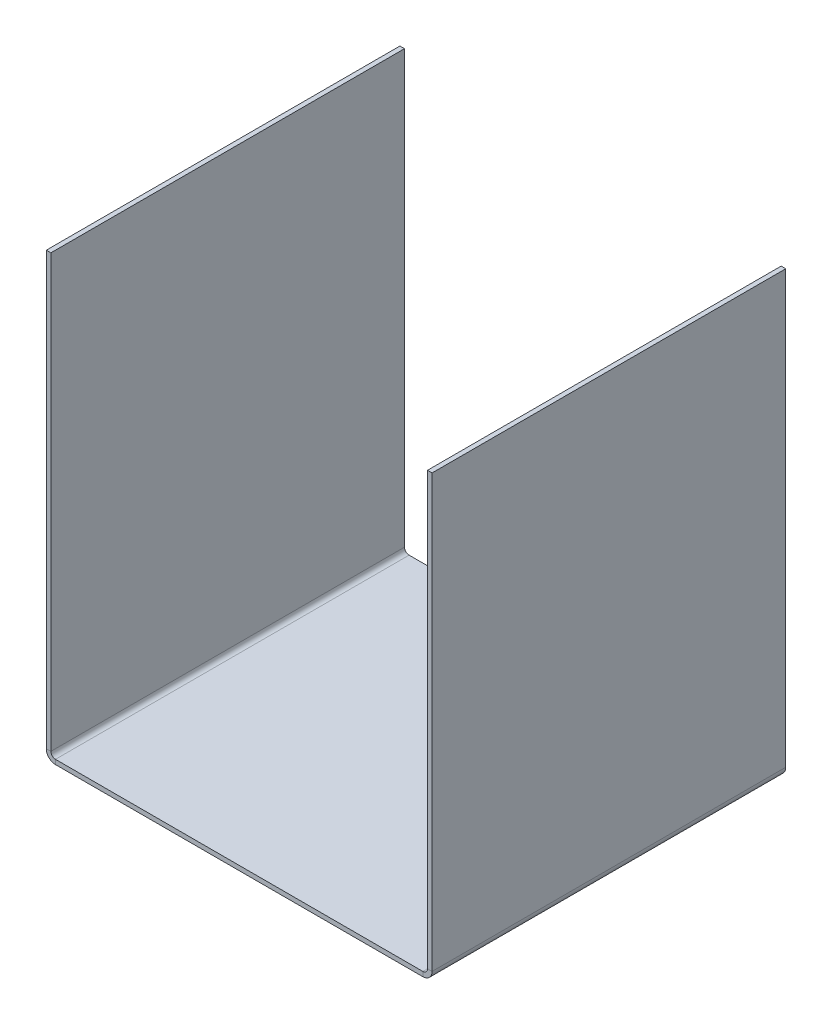
ISO-10303-21;
HEADER;
FILE_DESCRIPTION(('STEP AP214'),'2;1');
FILE_NAME('part.step','',(''),(''),'','','');
FILE_SCHEMA(('AUTOMOTIVE_DESIGN { 1 0 10303 214 1 1 1 1 }'));
ENDSEC;
DATA;
#1=APPLICATION_CONTEXT('core data for automotive mechanical design processes');
#2=APPLICATION_PROTOCOL_DEFINITION('international standard','automotive_design',2000,#1);
#3=PRODUCT_CONTEXT('',#1,'mechanical');
#4=PRODUCT('Part','Part','',(#3));
#5=PRODUCT_RELATED_PRODUCT_CATEGORY('part','',(#4));
#6=PRODUCT_DEFINITION_FORMATION('','',#4);
#7=PRODUCT_DEFINITION_CONTEXT('part definition',#1,'design');
#8=PRODUCT_DEFINITION('design','',#6,#7);
#9=PRODUCT_DEFINITION_SHAPE('','',#8);
#10=(LENGTH_UNIT() NAMED_UNIT(*) SI_UNIT(.MILLI.,.METRE.));
#11=(NAMED_UNIT(*) PLANE_ANGLE_UNIT() SI_UNIT($,.RADIAN.));
#12=(NAMED_UNIT(*) SI_UNIT($,.STERADIAN.) SOLID_ANGLE_UNIT());
#13=UNCERTAINTY_MEASURE_WITH_UNIT(LENGTH_MEASURE(1.E-05),#10,'distance_accuracy_value','');
#14=(GEOMETRIC_REPRESENTATION_CONTEXT(3) GLOBAL_UNCERTAINTY_ASSIGNED_CONTEXT((#13)) GLOBAL_UNIT_ASSIGNED_CONTEXT((#10,
#11,#12)) REPRESENTATION_CONTEXT('',''));
#15=CARTESIAN_POINT('',(0.,0.,0.));
#16=DIRECTION('',(0.,0.,1.));
#17=DIRECTION('',(1.,0.,0.));
#18=AXIS2_PLACEMENT_3D('',#15,#16,#17);
#19=CARTESIAN_POINT('',(-205.,-235.,5.));
#20=DIRECTION('',(0.,0.,1.));
#21=DIRECTION('',(-1.,0.,0.));
#22=AXIS2_PLACEMENT_3D('',#19,#20,#21);
#23=PLANE('',#22);
#24=DIRECTION('',(0.,1.,0.));
#25=VECTOR('',#24,1.);
#26=CARTESIAN_POINT('',(200.,-235.,5.));
#27=LINE('',#26,#25);
#28=CARTESIAN_POINT('',(200.,-240.,5.));
#29=VERTEX_POINT('',#28);
#30=CARTESIAN_POINT('',(200.,-235.,5.));
#31=VERTEX_POINT('',#30);
#32=EDGE_CURVE('E11',#29,#31,#27,.T.);
#33=ORIENTED_EDGE('',*,*,#32,.F.);
#34=DIRECTION('',(1.,0.,0.));
#35=VECTOR('',#34,1.);
#36=CARTESIAN_POINT('',(-205.,-240.,5.));
#37=LINE('',#36,#35);
#38=CARTESIAN_POINT('',(-200.,-240.,5.));
#39=VERTEX_POINT('',#38);
#40=EDGE_CURVE('E94',#29,#39,#37,.F.);
#41=ORIENTED_EDGE('',*,*,#40,.T.);
#42=DIRECTION('',(0.,1.,0.));
#43=VECTOR('',#42,1.);
#44=CARTESIAN_POINT('',(-200.,-235.,5.));
#45=LINE('',#44,#43);
#46=CARTESIAN_POINT('',(-200.,-235.,5.));
#47=VERTEX_POINT('',#46);
#48=EDGE_CURVE('E47',#39,#47,#45,.T.);
#49=ORIENTED_EDGE('',*,*,#48,.T.);
#50=DIRECTION('',(-1.,0.,0.));
#51=VECTOR('',#50,1.);
#52=CARTESIAN_POINT('',(-205.,-235.,5.));
#53=LINE('',#52,#51);
#54=EDGE_CURVE('E96',#31,#47,#53,.T.);
#55=ORIENTED_EDGE('',*,*,#54,.F.);
#56=EDGE_LOOP('',(#33,#41,#49,#55));
#57=FACE_BOUND('',#56,.T.);
#58=ADVANCED_FACE('F37',(#57),#23,.F.);
#59=CARTESIAN_POINT('',(-200.,-230.,5.));
#60=DIRECTION('',(0.,0.,-1.));
#61=DIRECTION('',(-1.,0.,0.));
#62=AXIS2_PLACEMENT_3D('',#59,#60,#61);
#63=PLANE('',#62);
#64=ORIENTED_EDGE('',*,*,#48,.F.);
#65=CARTESIAN_POINT('',(-200.,-230.,5.));
#66=DIRECTION('',(0.,0.,1.));
#67=DIRECTION('',(1.,0.,0.));
#68=AXIS2_PLACEMENT_3D('',#65,#66,#67);
#69=CIRCLE('',#68,10.);
#70=CARTESIAN_POINT('',(-210.,-230.,5.));
#71=VERTEX_POINT('',#70);
#72=EDGE_CURVE('E135',#39,#71,#69,.F.);
#73=ORIENTED_EDGE('',*,*,#72,.T.);
#74=DIRECTION('',(1.,0.,0.));
#75=VECTOR('',#74,1.);
#76=CARTESIAN_POINT('',(-205.,-230.,5.));
#77=LINE('',#76,#75);
#78=CARTESIAN_POINT('',(-205.,-230.,5.));
#79=VERTEX_POINT('',#78);
#80=EDGE_CURVE('E162',#71,#79,#77,.T.);
#81=ORIENTED_EDGE('',*,*,#80,.T.);
#82=CARTESIAN_POINT('',(-200.,-230.,5.));
#83=DIRECTION('',(0.,0.,1.));
#84=DIRECTION('',(1.,0.,0.));
#85=AXIS2_PLACEMENT_3D('',#82,#83,#84);
#86=CIRCLE('',#85,5.);
#87=EDGE_CURVE('E171',#47,#79,#86,.F.);
#88=ORIENTED_EDGE('',*,*,#87,.F.);
#89=EDGE_LOOP('',(#64,#73,#81,#88));
#90=FACE_BOUND('',#89,.T.);
#91=ADVANCED_FACE('F170',(#90),#63,.T.);
#92=CARTESIAN_POINT('',(-205.,240.,5.));
#93=DIRECTION('',(0.,0.,1.));
#94=DIRECTION('',(0.,1.,0.));
#95=AXIS2_PLACEMENT_3D('',#92,#93,#94);
#96=PLANE('',#95);
#97=ORIENTED_EDGE('',*,*,#80,.F.);
#98=DIRECTION('',(0.,-1.,0.));
#99=VECTOR('',#98,1.);
#100=CARTESIAN_POINT('',(-210.,240.,5.));
#101=LINE('',#100,#99);
#102=CARTESIAN_POINT('',(-210.,240.,5.));
#103=VERTEX_POINT('',#102);
#104=EDGE_CURVE('E132',#71,#103,#101,.F.);
#105=ORIENTED_EDGE('',*,*,#104,.T.);
#106=DIRECTION('',(1.,0.,0.));
#107=VECTOR('',#106,1.);
#108=CARTESIAN_POINT('',(-205.,240.,5.));
#109=LINE('',#108,#107);
#110=CARTESIAN_POINT('',(-205.,240.,5.));
#111=VERTEX_POINT('',#110);
#112=EDGE_CURVE('E159',#103,#111,#109,.T.);
#113=ORIENTED_EDGE('',*,*,#112,.T.);
#114=DIRECTION('',(0.,1.,0.));
#115=VECTOR('',#114,1.);
#116=CARTESIAN_POINT('',(-205.,240.,5.));
#117=LINE('',#116,#115);
#118=EDGE_CURVE('E190',#79,#111,#117,.T.);
#119=ORIENTED_EDGE('',*,*,#118,.F.);
#120=EDGE_LOOP('',(#97,#105,#113,#119));
#121=FACE_BOUND('',#120,.T.);
#122=ADVANCED_FACE('F191',(#121),#96,.F.);
#123=CARTESIAN_POINT('',(-205.,240.,390.));
#124=DIRECTION('',(0.,1.,0.));
#125=DIRECTION('',(0.,0.,-1.));
#126=AXIS2_PLACEMENT_3D('',#123,#124,#125);
#127=PLANE('',#126);
#128=ORIENTED_EDGE('',*,*,#112,.F.);
#129=DIRECTION('',(0.,0.,1.));
#130=VECTOR('',#129,1.);
#131=CARTESIAN_POINT('',(-210.,240.,390.));
#132=LINE('',#131,#130);
#133=CARTESIAN_POINT('',(-210.,240.,390.));
#134=VERTEX_POINT('',#133);
#135=EDGE_CURVE('E228',#134,#103,#132,.F.);
#136=ORIENTED_EDGE('',*,*,#135,.F.);
#137=DIRECTION('',(1.,0.,0.));
#138=VECTOR('',#137,1.);
#139=CARTESIAN_POINT('',(-205.,240.,390.));
#140=LINE('',#139,#138);
#141=CARTESIAN_POINT('',(-205.,240.,390.));
#142=VERTEX_POINT('',#141);
#143=EDGE_CURVE('E156',#134,#142,#140,.T.);
#144=ORIENTED_EDGE('',*,*,#143,.T.);
#145=DIRECTION('',(0.,0.,-1.));
#146=VECTOR('',#145,1.);
#147=CARTESIAN_POINT('',(-205.,240.,390.));
#148=LINE('',#147,#146);
#149=EDGE_CURVE('E195',#142,#111,#148,.T.);
#150=ORIENTED_EDGE('',*,*,#149,.T.);
#151=EDGE_LOOP('',(#128,#136,#144,#150));
#152=FACE_BOUND('',#151,.T.);
#153=ADVANCED_FACE('F239',(#152),#127,.T.);
#154=CARTESIAN_POINT('',(-205.,240.,390.));
#155=DIRECTION('',(0.,0.,1.));
#156=DIRECTION('',(0.,1.,0.));
#157=AXIS2_PLACEMENT_3D('',#154,#155,#156);
#158=PLANE('',#157);
#159=ORIENTED_EDGE('',*,*,#143,.F.);
#160=DIRECTION('',(0.,-1.,0.));
#161=VECTOR('',#160,1.);
#162=CARTESIAN_POINT('',(-210.,240.,390.));
#163=LINE('',#162,#161);
#164=CARTESIAN_POINT('',(-210.,-230.,390.));
#165=VERTEX_POINT('',#164);
#166=EDGE_CURVE('E125',#165,#134,#163,.F.);
#167=ORIENTED_EDGE('',*,*,#166,.F.);
#168=DIRECTION('',(1.,0.,0.));
#169=VECTOR('',#168,1.);
#170=CARTESIAN_POINT('',(-205.,-230.,390.));
#171=LINE('',#170,#169);
#172=CARTESIAN_POINT('',(-205.,-230.,390.));
#173=VERTEX_POINT('',#172);
#174=EDGE_CURVE('E153',#165,#173,#171,.T.);
#175=ORIENTED_EDGE('',*,*,#174,.T.);
#176=DIRECTION('',(0.,1.,0.));
#177=VECTOR('',#176,1.);
#178=CARTESIAN_POINT('',(-205.,240.,390.));
#179=LINE('',#178,#177);
#180=EDGE_CURVE('E201',#173,#142,#179,.T.);
#181=ORIENTED_EDGE('',*,*,#180,.T.);
#182=EDGE_LOOP('',(#159,#167,#175,#181));
#183=FACE_BOUND('',#182,.T.);
#184=ADVANCED_FACE('F289',(#183),#158,.T.);
#185=CARTESIAN_POINT('',(-200.,-230.,390.));
#186=DIRECTION('',(0.,0.,1.));
#187=DIRECTION('',(1.,0.,0.));
#188=AXIS2_PLACEMENT_3D('',#185,#186,#187);
#189=PLANE('',#188);
#190=ORIENTED_EDGE('',*,*,#174,.F.);
#191=CARTESIAN_POINT('',(-200.,-230.,390.));
#192=DIRECTION('',(0.,0.,1.));
#193=DIRECTION('',(1.,0.,0.));
#194=AXIS2_PLACEMENT_3D('',#191,#192,#193);
#195=CIRCLE('',#194,10.);
#196=CARTESIAN_POINT('',(-200.,-240.,390.));
#197=VERTEX_POINT('',#196);
#198=EDGE_CURVE('E130',#165,#197,#195,.T.);
#199=ORIENTED_EDGE('',*,*,#198,.T.);
#200=DIRECTION('',(0.,1.,0.));
#201=VECTOR('',#200,1.);
#202=CARTESIAN_POINT('',(-200.,-235.,390.));
#203=LINE('',#202,#201);
#204=CARTESIAN_POINT('',(-200.,-235.,390.));
#205=VERTEX_POINT('',#204);
#206=EDGE_CURVE('E151',#197,#205,#203,.T.);
#207=ORIENTED_EDGE('',*,*,#206,.T.);
#208=CARTESIAN_POINT('',(-200.,-230.,390.));
#209=DIRECTION('',(0.,0.,-1.));
#210=DIRECTION('',(-1.,0.,0.));
#211=AXIS2_PLACEMENT_3D('',#208,#209,#210);
#212=CIRCLE('',#211,5.);
#213=EDGE_CURVE('E187',#173,#205,#212,.F.);
#214=ORIENTED_EDGE('',*,*,#213,.F.);
#215=EDGE_LOOP('',(#190,#199,#207,#214));
#216=FACE_BOUND('',#215,.T.);
#217=ADVANCED_FACE('F291',(#216),#189,.T.);
#218=CARTESIAN_POINT('',(-205.,-235.,390.));
#219=DIRECTION('',(0.,0.,1.));
#220=DIRECTION('',(-1.,0.,0.));
#221=AXIS2_PLACEMENT_3D('',#218,#219,#220);
#222=PLANE('',#221);
#223=ORIENTED_EDGE('',*,*,#206,.F.);
#224=DIRECTION('',(1.,0.,0.));
#225=VECTOR('',#224,1.);
#226=CARTESIAN_POINT('',(-205.,-240.,390.));
#227=LINE('',#226,#225);
#228=CARTESIAN_POINT('',(200.,-240.,390.));
#229=VERTEX_POINT('',#228);
#230=EDGE_CURVE('E124',#229,#197,#227,.F.);
#231=ORIENTED_EDGE('',*,*,#230,.F.);
#232=DIRECTION('',(0.,1.,0.));
#233=VECTOR('',#232,1.);
#234=CARTESIAN_POINT('',(200.,-235.,390.));
#235=LINE('',#234,#233);
#236=CARTESIAN_POINT('',(200.,-235.,390.));
#237=VERTEX_POINT('',#236);
#238=EDGE_CURVE('E148',#229,#237,#235,.T.);
#239=ORIENTED_EDGE('',*,*,#238,.T.);
#240=DIRECTION('',(-1.,0.,0.));
#241=VECTOR('',#240,1.);
#242=CARTESIAN_POINT('',(-205.,-235.,390.));
#243=LINE('',#242,#241);
#244=EDGE_CURVE('E246',#237,#205,#243,.T.);
#245=ORIENTED_EDGE('',*,*,#244,.T.);
#246=EDGE_LOOP('',(#223,#231,#239,#245));
#247=FACE_BOUND('',#246,.T.);
#248=ADVANCED_FACE('F294',(#247),#222,.T.);
#249=CARTESIAN_POINT('',(200.,-230.,390.));
#250=DIRECTION('',(0.,0.,1.));
#251=DIRECTION('',(1.,0.,0.));
#252=AXIS2_PLACEMENT_3D('',#249,#250,#251);
#253=PLANE('',#252);
#254=ORIENTED_EDGE('',*,*,#238,.F.);
#255=CARTESIAN_POINT('',(200.,-230.,390.));
#256=DIRECTION('',(0.,0.,1.));
#257=DIRECTION('',(1.,0.,0.));
#258=AXIS2_PLACEMENT_3D('',#255,#256,#257);
#259=CIRCLE('',#258,10.);
#260=CARTESIAN_POINT('',(210.,-230.,390.));
#261=VERTEX_POINT('',#260);
#262=EDGE_CURVE('E112',#229,#261,#259,.T.);
#263=ORIENTED_EDGE('',*,*,#262,.T.);
#264=DIRECTION('',(-1.,0.,0.));
#265=VECTOR('',#264,1.);
#266=CARTESIAN_POINT('',(205.,-230.,390.));
#267=LINE('',#266,#265);
#268=CARTESIAN_POINT('',(205.,-230.,390.));
#269=VERTEX_POINT('',#268);
#270=EDGE_CURVE('E145',#261,#269,#267,.T.);
#271=ORIENTED_EDGE('',*,*,#270,.T.);
#272=CARTESIAN_POINT('',(200.,-230.,390.));
#273=DIRECTION('',(0.,0.,-1.));
#274=DIRECTION('',(-1.,0.,0.));
#275=AXIS2_PLACEMENT_3D('',#272,#273,#274);
#276=CIRCLE('',#275,5.);
#277=EDGE_CURVE('E196',#237,#269,#276,.F.);
#278=ORIENTED_EDGE('',*,*,#277,.F.);
#279=EDGE_LOOP('',(#254,#263,#271,#278));
#280=FACE_BOUND('',#279,.T.);
#281=ADVANCED_FACE('F321',(#280),#253,.T.);
#282=CARTESIAN_POINT('',(205.,-235.,390.));
#283=DIRECTION('',(0.,0.,1.));
#284=DIRECTION('',(0.,-1.,0.));
#285=AXIS2_PLACEMENT_3D('',#282,#283,#284);
#286=PLANE('',#285);
#287=ORIENTED_EDGE('',*,*,#270,.F.);
#288=DIRECTION('',(0.,1.,0.));
#289=VECTOR('',#288,1.);
#290=CARTESIAN_POINT('',(210.,-235.,390.));
#291=LINE('',#290,#289);
#292=CARTESIAN_POINT('',(210.,240.,390.));
#293=VERTEX_POINT('',#292);
#294=EDGE_CURVE('E220',#293,#261,#291,.F.);
#295=ORIENTED_EDGE('',*,*,#294,.F.);
#296=DIRECTION('',(-1.,0.,0.));
#297=VECTOR('',#296,1.);
#298=CARTESIAN_POINT('',(205.,240.,390.));
#299=LINE('',#298,#297);
#300=CARTESIAN_POINT('',(205.,240.,390.));
#301=VERTEX_POINT('',#300);
#302=EDGE_CURVE('E142',#293,#301,#299,.T.);
#303=ORIENTED_EDGE('',*,*,#302,.T.);
#304=DIRECTION('',(0.,-1.,0.));
#305=VECTOR('',#304,1.);
#306=CARTESIAN_POINT('',(205.,-235.,390.));
#307=LINE('',#306,#305);
#308=EDGE_CURVE('E252',#301,#269,#307,.T.);
#309=ORIENTED_EDGE('',*,*,#308,.T.);
#310=EDGE_LOOP('',(#287,#295,#303,#309));
#311=FACE_BOUND('',#310,.T.);
#312=ADVANCED_FACE('F270',(#311),#286,.T.);
#313=CARTESIAN_POINT('',(205.,240.,390.));
#314=DIRECTION('',(0.,-1.,0.));
#315=DIRECTION('',(0.,0.,-1.));
#316=AXIS2_PLACEMENT_3D('',#313,#314,#315);
#317=PLANE('',#316);
#318=ORIENTED_EDGE('',*,*,#302,.F.);
#319=DIRECTION('',(0.,0.,-1.));
#320=VECTOR('',#319,1.);
#321=CARTESIAN_POINT('',(210.,240.,390.));
#322=LINE('',#321,#320);
#323=CARTESIAN_POINT('',(210.,240.,5.));
#324=VERTEX_POINT('',#323);
#325=EDGE_CURVE('E117',#293,#324,#322,.T.);
#326=ORIENTED_EDGE('',*,*,#325,.T.);
#327=DIRECTION('',(-1.,0.,0.));
#328=VECTOR('',#327,1.);
#329=CARTESIAN_POINT('',(205.,240.,5.));
#330=LINE('',#329,#328);
#331=CARTESIAN_POINT('',(205.,240.,5.));
#332=VERTEX_POINT('',#331);
#333=EDGE_CURVE('E139',#324,#332,#330,.T.);
#334=ORIENTED_EDGE('',*,*,#333,.T.);
#335=DIRECTION('',(0.,0.,-1.));
#336=VECTOR('',#335,1.);
#337=CARTESIAN_POINT('',(205.,240.,390.));
#338=LINE('',#337,#336);
#339=EDGE_CURVE('E255',#301,#332,#338,.T.);
#340=ORIENTED_EDGE('',*,*,#339,.F.);
#341=EDGE_LOOP('',(#318,#326,#334,#340));
#342=FACE_BOUND('',#341,.T.);
#343=ADVANCED_FACE('F326',(#342),#317,.F.);
#344=CARTESIAN_POINT('',(205.,-235.,5.));
#345=DIRECTION('',(0.,0.,1.));
#346=DIRECTION('',(0.,-1.,0.));
#347=AXIS2_PLACEMENT_3D('',#344,#345,#346);
#348=PLANE('',#347);
#349=ORIENTED_EDGE('',*,*,#333,.F.);
#350=DIRECTION('',(0.,1.,0.));
#351=VECTOR('',#350,1.);
#352=CARTESIAN_POINT('',(210.,-235.,5.));
#353=LINE('',#352,#351);
#354=CARTESIAN_POINT('',(210.,-230.,5.));
#355=VERTEX_POINT('',#354);
#356=EDGE_CURVE('E218',#324,#355,#353,.F.);
#357=ORIENTED_EDGE('',*,*,#356,.T.);
#358=DIRECTION('',(-1.,0.,0.));
#359=VECTOR('',#358,1.);
#360=CARTESIAN_POINT('',(205.,-230.,5.));
#361=LINE('',#360,#359);
#362=CARTESIAN_POINT('',(205.,-230.,5.));
#363=VERTEX_POINT('',#362);
#364=EDGE_CURVE('E41',#355,#363,#361,.T.);
#365=ORIENTED_EDGE('',*,*,#364,.T.);
#366=DIRECTION('',(0.,-1.,0.));
#367=VECTOR('',#366,1.);
#368=CARTESIAN_POINT('',(205.,-235.,5.));
#369=LINE('',#368,#367);
#370=EDGE_CURVE('E249',#332,#363,#369,.T.);
#371=ORIENTED_EDGE('',*,*,#370,.F.);
#372=EDGE_LOOP('',(#349,#357,#365,#371));
#373=FACE_BOUND('',#372,.T.);
#374=ADVANCED_FACE('F280',(#373),#348,.F.);
#375=CARTESIAN_POINT('',(200.,-230.,5.));
#376=DIRECTION('',(0.,0.,-1.));
#377=DIRECTION('',(-1.,0.,0.));
#378=AXIS2_PLACEMENT_3D('',#375,#376,#377);
#379=PLANE('',#378);
#380=CARTESIAN_POINT('',(200.,-230.,5.));
#381=DIRECTION('',(0.,0.,1.));
#382=DIRECTION('',(1.,0.,0.));
#383=AXIS2_PLACEMENT_3D('',#380,#381,#382);
#384=CIRCLE('',#383,10.);
#385=EDGE_CURVE('E109',#355,#29,#384,.F.);
#386=ORIENTED_EDGE('',*,*,#385,.T.);
#387=ORIENTED_EDGE('',*,*,#32,.T.);
#388=CARTESIAN_POINT('',(200.,-230.,5.));
#389=DIRECTION('',(0.,0.,1.));
#390=DIRECTION('',(1.,0.,0.));
#391=AXIS2_PLACEMENT_3D('',#388,#389,#390);
#392=CIRCLE('',#391,5.);
#393=EDGE_CURVE('E213',#363,#31,#392,.F.);
#394=ORIENTED_EDGE('',*,*,#393,.F.);
#395=ORIENTED_EDGE('',*,*,#364,.F.);
#396=EDGE_LOOP('',(#386,#387,#394,#395));
#397=FACE_BOUND('',#396,.T.);
#398=ADVANCED_FACE('F39',(#397),#379,.T.);
#399=CARTESIAN_POINT('',(205.,-235.,390.));
#400=DIRECTION('',(1.,0.,0.));
#401=DIRECTION('',(0.,0.,-1.));
#402=AXIS2_PLACEMENT_3D('',#399,#400,#401);
#403=PLANE('',#402);
#404=ORIENTED_EDGE('',*,*,#370,.T.);
#405=DIRECTION('',(0.,0.,-1.));
#406=VECTOR('',#405,1.);
#407=CARTESIAN_POINT('',(205.,-230.,390.));
#408=LINE('',#407,#406);
#409=EDGE_CURVE('E203',#363,#269,#408,.F.);
#410=ORIENTED_EDGE('',*,*,#409,.T.);
#411=ORIENTED_EDGE('',*,*,#308,.F.);
#412=ORIENTED_EDGE('',*,*,#339,.T.);
#413=EDGE_LOOP('',(#404,#410,#411,#412));
#414=FACE_BOUND('',#413,.T.);
#415=ADVANCED_FACE('F275',(#414),#403,.F.);
#416=CARTESIAN_POINT('',(-205.,-235.,390.));
#417=DIRECTION('',(0.,-1.,0.));
#418=DIRECTION('',(1.,0.,0.));
#419=AXIS2_PLACEMENT_3D('',#416,#417,#418);
#420=PLANE('',#419);
#421=ORIENTED_EDGE('',*,*,#54,.T.);
#422=DIRECTION('',(0.,0.,-1.));
#423=VECTOR('',#422,1.);
#424=CARTESIAN_POINT('',(-200.,-235.,390.));
#425=LINE('',#424,#423);
#426=EDGE_CURVE('E186',#47,#205,#425,.F.);
#427=ORIENTED_EDGE('',*,*,#426,.T.);
#428=ORIENTED_EDGE('',*,*,#244,.F.);
#429=DIRECTION('',(0.,0.,-1.));
#430=VECTOR('',#429,1.);
#431=CARTESIAN_POINT('',(200.,-235.,5.));
#432=LINE('',#431,#430);
#433=EDGE_CURVE('E207',#237,#31,#432,.T.);
#434=ORIENTED_EDGE('',*,*,#433,.T.);
#435=EDGE_LOOP('',(#421,#427,#428,#434));
#436=FACE_BOUND('',#435,.T.);
#437=ADVANCED_FACE('F296',(#436),#420,.F.);
#438=CARTESIAN_POINT('',(-205.,240.,390.));
#439=DIRECTION('',(-1.,0.,0.));
#440=DIRECTION('',(0.,-1.,0.));
#441=AXIS2_PLACEMENT_3D('',#438,#439,#440);
#442=PLANE('',#441);
#443=ORIENTED_EDGE('',*,*,#180,.F.);
#444=DIRECTION('',(0.,0.,-1.));
#445=VECTOR('',#444,1.);
#446=CARTESIAN_POINT('',(-205.,-230.,5.));
#447=LINE('',#446,#445);
#448=EDGE_CURVE('E184',#173,#79,#447,.T.);
#449=ORIENTED_EDGE('',*,*,#448,.T.);
#450=ORIENTED_EDGE('',*,*,#118,.T.);
#451=ORIENTED_EDGE('',*,*,#149,.F.);
#452=EDGE_LOOP('',(#443,#449,#450,#451));
#453=FACE_BOUND('',#452,.T.);
#454=ADVANCED_FACE('F199',(#453),#442,.F.);
#455=CARTESIAN_POINT('',(200.,-230.,390.));
#456=DIRECTION('',(0.,0.,1.));
#457=DIRECTION('',(1.,0.,0.));
#458=AXIS2_PLACEMENT_3D('',#455,#456,#457);
#459=CYLINDRICAL_SURFACE('',#458,5.);
#460=ORIENTED_EDGE('',*,*,#277,.T.);
#461=ORIENTED_EDGE('',*,*,#409,.F.);
#462=ORIENTED_EDGE('',*,*,#393,.T.);
#463=ORIENTED_EDGE('',*,*,#433,.F.);
#464=EDGE_LOOP('',(#460,#461,#462,#463));
#465=FACE_BOUND('',#464,.T.);
#466=ADVANCED_FACE('F263',(#465),#459,.F.);
#467=CARTESIAN_POINT('',(-200.,-230.,390.));
#468=DIRECTION('',(0.,0.,1.));
#469=DIRECTION('',(1.,0.,0.));
#470=AXIS2_PLACEMENT_3D('',#467,#468,#469);
#471=CYLINDRICAL_SURFACE('',#470,5.);
#472=ORIENTED_EDGE('',*,*,#213,.T.);
#473=ORIENTED_EDGE('',*,*,#426,.F.);
#474=ORIENTED_EDGE('',*,*,#87,.T.);
#475=ORIENTED_EDGE('',*,*,#448,.F.);
#476=EDGE_LOOP('',(#472,#473,#474,#475));
#477=FACE_BOUND('',#476,.T.);
#478=ADVANCED_FACE('F182',(#477),#471,.F.);
#479=CARTESIAN_POINT('',(210.,-235.,390.));
#480=DIRECTION('',(1.,0.,0.));
#481=DIRECTION('',(0.,0.,-1.));
#482=AXIS2_PLACEMENT_3D('',#479,#480,#481);
#483=PLANE('',#482);
#484=ORIENTED_EDGE('',*,*,#356,.F.);
#485=ORIENTED_EDGE('',*,*,#325,.F.);
#486=ORIENTED_EDGE('',*,*,#294,.T.);
#487=DIRECTION('',(0.,0.,-1.));
#488=VECTOR('',#487,1.);
#489=CARTESIAN_POINT('',(210.,-230.,390.));
#490=LINE('',#489,#488);
#491=EDGE_CURVE('E116',#355,#261,#490,.F.);
#492=ORIENTED_EDGE('',*,*,#491,.F.);
#493=EDGE_LOOP('',(#484,#485,#486,#492));
#494=FACE_BOUND('',#493,.T.);
#495=ADVANCED_FACE('F341',(#494),#483,.T.);
#496=CARTESIAN_POINT('',(-205.,-240.,390.));
#497=DIRECTION('',(0.,-1.,0.));
#498=DIRECTION('',(1.,0.,0.));
#499=AXIS2_PLACEMENT_3D('',#496,#497,#498);
#500=PLANE('',#499);
#501=ORIENTED_EDGE('',*,*,#40,.F.);
#502=DIRECTION('',(0.,0.,1.));
#503=VECTOR('',#502,1.);
#504=CARTESIAN_POINT('',(200.,-240.,390.));
#505=LINE('',#504,#503);
#506=EDGE_CURVE('E106',#229,#29,#505,.F.);
#507=ORIENTED_EDGE('',*,*,#506,.F.);
#508=ORIENTED_EDGE('',*,*,#230,.T.);
#509=DIRECTION('',(0.,0.,1.));
#510=VECTOR('',#509,1.);
#511=CARTESIAN_POINT('',(-200.,-240.,390.));
#512=LINE('',#511,#510);
#513=EDGE_CURVE('E122',#39,#197,#512,.T.);
#514=ORIENTED_EDGE('',*,*,#513,.F.);
#515=EDGE_LOOP('',(#501,#507,#508,#514));
#516=FACE_BOUND('',#515,.T.);
#517=ADVANCED_FACE('F120',(#516),#500,.T.);
#518=CARTESIAN_POINT('',(-210.,240.,390.));
#519=DIRECTION('',(-1.,0.,0.));
#520=DIRECTION('',(0.,-1.,0.));
#521=AXIS2_PLACEMENT_3D('',#518,#519,#520);
#522=PLANE('',#521);
#523=ORIENTED_EDGE('',*,*,#166,.T.);
#524=ORIENTED_EDGE('',*,*,#135,.T.);
#525=ORIENTED_EDGE('',*,*,#104,.F.);
#526=DIRECTION('',(0.,0.,1.));
#527=VECTOR('',#526,1.);
#528=CARTESIAN_POINT('',(-210.,-230.,390.));
#529=LINE('',#528,#527);
#530=EDGE_CURVE('E214',#165,#71,#529,.F.);
#531=ORIENTED_EDGE('',*,*,#530,.F.);
#532=EDGE_LOOP('',(#523,#524,#525,#531));
#533=FACE_BOUND('',#532,.T.);
#534=ADVANCED_FACE('F234',(#533),#522,.T.);
#535=CARTESIAN_POINT('',(200.,-230.,390.));
#536=DIRECTION('',(0.,0.,1.));
#537=DIRECTION('',(1.,0.,0.));
#538=AXIS2_PLACEMENT_3D('',#535,#536,#537);
#539=CYLINDRICAL_SURFACE('',#538,10.);
#540=ORIENTED_EDGE('',*,*,#262,.F.);
#541=ORIENTED_EDGE('',*,*,#506,.T.);
#542=ORIENTED_EDGE('',*,*,#385,.F.);
#543=ORIENTED_EDGE('',*,*,#491,.T.);
#544=EDGE_LOOP('',(#540,#541,#542,#543));
#545=FACE_BOUND('',#544,.T.);
#546=ADVANCED_FACE('F107',(#545),#539,.T.);
#547=CARTESIAN_POINT('',(-200.,-230.,390.));
#548=DIRECTION('',(0.,0.,1.));
#549=DIRECTION('',(1.,0.,0.));
#550=AXIS2_PLACEMENT_3D('',#547,#548,#549);
#551=CYLINDRICAL_SURFACE('',#550,10.);
#552=ORIENTED_EDGE('',*,*,#198,.F.);
#553=ORIENTED_EDGE('',*,*,#530,.T.);
#554=ORIENTED_EDGE('',*,*,#72,.F.);
#555=ORIENTED_EDGE('',*,*,#513,.T.);
#556=EDGE_LOOP('',(#552,#553,#554,#555));
#557=FACE_BOUND('',#556,.T.);
#558=ADVANCED_FACE('F331',(#557),#551,.T.);
#559=CLOSED_SHELL('',(#58,#91,#122,#153,#184,#217,#248,#281,#312,#343,#374,#398,#415,#437,#454,
#466,#478,#495,#517,#534,#546,#558));
#560=MANIFOLD_SOLID_BREP('B2',#559);
#561=ADVANCED_BREP_SHAPE_REPRESENTATION('',(#18,#560),#14);
#562=SHAPE_DEFINITION_REPRESENTATION(#9,#561);
ENDSEC;
END-ISO-10303-21;
